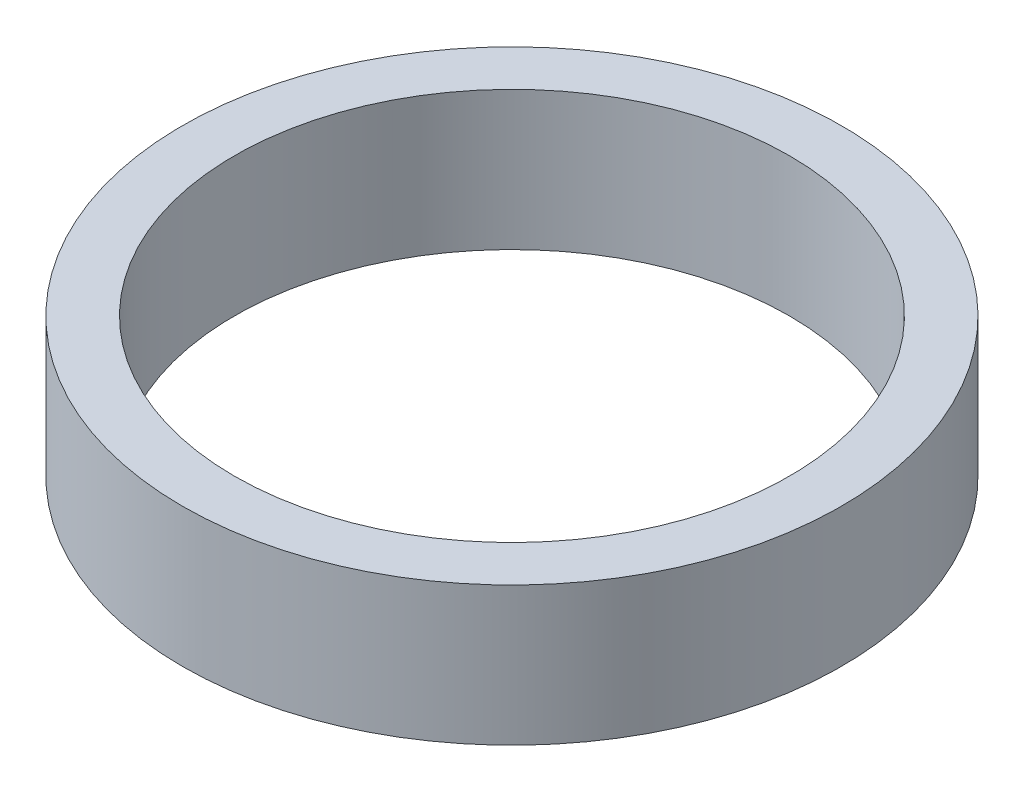
ISO-10303-21;
HEADER;
FILE_DESCRIPTION(('STEP AP214'),'2;1');
FILE_NAME('part.step','',(''),(''),'','','');
FILE_SCHEMA(('AUTOMOTIVE_DESIGN { 1 0 10303 214 1 1 1 1 }'));
ENDSEC;
DATA;
#1=APPLICATION_CONTEXT('core data for automotive mechanical design processes');
#2=APPLICATION_PROTOCOL_DEFINITION('international standard','automotive_design',2000,#1);
#3=PRODUCT_CONTEXT('',#1,'mechanical');
#4=PRODUCT('Part','Part','',(#3));
#5=PRODUCT_RELATED_PRODUCT_CATEGORY('part','',(#4));
#6=PRODUCT_DEFINITION_FORMATION('','',#4);
#7=PRODUCT_DEFINITION_CONTEXT('part definition',#1,'design');
#8=PRODUCT_DEFINITION('design','',#6,#7);
#9=PRODUCT_DEFINITION_SHAPE('','',#8);
#10=(LENGTH_UNIT() NAMED_UNIT(*) SI_UNIT(.MILLI.,.METRE.));
#11=(NAMED_UNIT(*) PLANE_ANGLE_UNIT() SI_UNIT($,.RADIAN.));
#12=(NAMED_UNIT(*) SI_UNIT($,.STERADIAN.) SOLID_ANGLE_UNIT());
#13=UNCERTAINTY_MEASURE_WITH_UNIT(LENGTH_MEASURE(1.E-05),#10,'distance_accuracy_value','');
#14=(GEOMETRIC_REPRESENTATION_CONTEXT(3) GLOBAL_UNCERTAINTY_ASSIGNED_CONTEXT((#13)) GLOBAL_UNIT_ASSIGNED_CONTEXT((#10,
#11,#12)) REPRESENTATION_CONTEXT('',''));
#15=CARTESIAN_POINT('',(0.,0.,0.));
#16=DIRECTION('',(0.,0.,1.));
#17=DIRECTION('',(1.,0.,0.));
#18=AXIS2_PLACEMENT_3D('',#15,#16,#17);
#19=CARTESIAN_POINT('',(0.,6.35,0.));
#20=DIRECTION('',(0.,1.,0.));
#21=DIRECTION('',(0.,0.,1.));
#22=AXIS2_PLACEMENT_3D('',#19,#20,#21);
#23=PLANE('',#22);
#24=CARTESIAN_POINT('',(0.,6.35,0.));
#25=DIRECTION('',(0.,1.,0.));
#26=DIRECTION('',(0.,0.,1.));
#27=AXIS2_PLACEMENT_3D('',#24,#25,#26);
#28=CIRCLE('',#27,30.1625);
#29=CARTESIAN_POINT('',(0.,6.35,30.1625));
#30=VERTEX_POINT('',#29);
#31=EDGE_CURVE('E10',#30,#30,#28,.T.);
#32=ORIENTED_EDGE('',*,*,#31,.T.);
#33=EDGE_LOOP('',(#32));
#34=FACE_BOUND('',#33,.T.);
#35=CARTESIAN_POINT('',(0.,6.35,0.));
#36=DIRECTION('',(0.,1.,0.));
#37=DIRECTION('',(0.,0.,1.));
#38=AXIS2_PLACEMENT_3D('',#35,#36,#37);
#39=CIRCLE('',#38,25.4);
#40=CARTESIAN_POINT('',(0.,6.35,25.4));
#41=VERTEX_POINT('',#40);
#42=EDGE_CURVE('E42',#41,#41,#39,.T.);
#43=ORIENTED_EDGE('',*,*,#42,.F.);
#44=EDGE_LOOP('',(#43));
#45=FACE_BOUND('',#44,.T.);
#46=ADVANCED_FACE('F31',(#34,#45),#23,.T.);
#47=CARTESIAN_POINT('',(0.,-6.35,0.));
#48=DIRECTION('',(0.,1.,0.));
#49=DIRECTION('',(0.,0.,1.));
#50=AXIS2_PLACEMENT_3D('',#47,#48,#49);
#51=PLANE('',#50);
#52=CARTESIAN_POINT('',(0.,-6.35,0.));
#53=DIRECTION('',(0.,1.,0.));
#54=DIRECTION('',(0.,0.,1.));
#55=AXIS2_PLACEMENT_3D('',#52,#53,#54);
#56=CIRCLE('',#55,30.1625);
#57=CARTESIAN_POINT('',(0.,-6.35,30.1625));
#58=VERTEX_POINT('',#57);
#59=EDGE_CURVE('E35',#58,#58,#56,.T.);
#60=ORIENTED_EDGE('',*,*,#59,.F.);
#61=EDGE_LOOP('',(#60));
#62=FACE_BOUND('',#61,.T.);
#63=CARTESIAN_POINT('',(0.,-6.35,0.));
#64=DIRECTION('',(0.,1.,0.));
#65=DIRECTION('',(0.,0.,1.));
#66=AXIS2_PLACEMENT_3D('',#63,#64,#65);
#67=CIRCLE('',#66,25.4);
#68=CARTESIAN_POINT('',(0.,-6.35,25.4));
#69=VERTEX_POINT('',#68);
#70=EDGE_CURVE('E44',#69,#69,#67,.T.);
#71=ORIENTED_EDGE('',*,*,#70,.T.);
#72=EDGE_LOOP('',(#71));
#73=FACE_BOUND('',#72,.T.);
#74=ADVANCED_FACE('F54',(#62,#73),#51,.F.);
#75=CARTESIAN_POINT('',(0.,6.35,0.));
#76=DIRECTION('',(0.,-1.,0.));
#77=DIRECTION('',(0.,0.,-1.));
#78=AXIS2_PLACEMENT_3D('',#75,#76,#77);
#79=CYLINDRICAL_SURFACE('',#78,30.1625);
#80=ORIENTED_EDGE('',*,*,#31,.F.);
#81=EDGE_LOOP('',(#80));
#82=FACE_BOUND('',#81,.T.);
#83=ORIENTED_EDGE('',*,*,#59,.T.);
#84=EDGE_LOOP('',(#83));
#85=FACE_BOUND('',#84,.T.);
#86=ADVANCED_FACE('F33',(#82,#85),#79,.T.);
#87=CARTESIAN_POINT('',(0.,6.35,0.));
#88=DIRECTION('',(0.,-1.,0.));
#89=DIRECTION('',(0.,0.,-1.));
#90=AXIS2_PLACEMENT_3D('',#87,#88,#89);
#91=CYLINDRICAL_SURFACE('',#90,25.4);
#92=ORIENTED_EDGE('',*,*,#42,.T.);
#93=EDGE_LOOP('',(#92));
#94=FACE_BOUND('',#93,.T.);
#95=ORIENTED_EDGE('',*,*,#70,.F.);
#96=EDGE_LOOP('',(#95));
#97=FACE_BOUND('',#96,.T.);
#98=ADVANCED_FACE('F50',(#94,#97),#91,.F.);
#99=CLOSED_SHELL('',(#46,#74,#86,#98));
#100=MANIFOLD_SOLID_BREP('B2',#99);
#101=ADVANCED_BREP_SHAPE_REPRESENTATION('',(#18,#100),#14);
#102=SHAPE_DEFINITION_REPRESENTATION(#9,#101);
ENDSEC;
END-ISO-10303-21;
